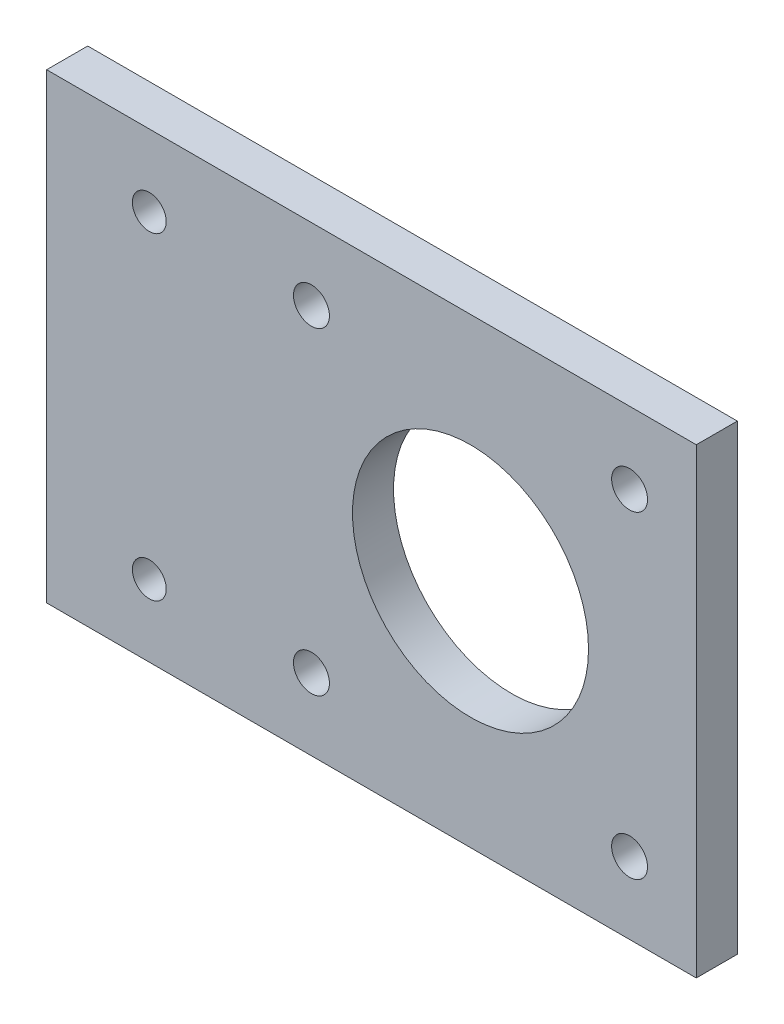
ISO-10303-21;
HEADER;
FILE_DESCRIPTION(('STEP AP214'),'2;1');
FILE_NAME('part.step','',(''),(''),'','','');
FILE_SCHEMA(('AUTOMOTIVE_DESIGN { 1 0 10303 214 1 1 1 1 }'));
ENDSEC;
DATA;
#1=APPLICATION_CONTEXT('core data for automotive mechanical design processes');
#2=APPLICATION_PROTOCOL_DEFINITION('international standard','automotive_design',2000,#1);
#3=PRODUCT_CONTEXT('',#1,'mechanical');
#4=PRODUCT('Part','Part','',(#3));
#5=PRODUCT_RELATED_PRODUCT_CATEGORY('part','',(#4));
#6=PRODUCT_DEFINITION_FORMATION('','',#4);
#7=PRODUCT_DEFINITION_CONTEXT('part definition',#1,'design');
#8=PRODUCT_DEFINITION('design','',#6,#7);
#9=PRODUCT_DEFINITION_SHAPE('','',#8);
#10=(LENGTH_UNIT() NAMED_UNIT(*) SI_UNIT(.MILLI.,.METRE.));
#11=(NAMED_UNIT(*) PLANE_ANGLE_UNIT() SI_UNIT($,.RADIAN.));
#12=(NAMED_UNIT(*) SI_UNIT($,.STERADIAN.) SOLID_ANGLE_UNIT());
#13=UNCERTAINTY_MEASURE_WITH_UNIT(LENGTH_MEASURE(1.E-05),#10,'distance_accuracy_value','');
#14=(GEOMETRIC_REPRESENTATION_CONTEXT(3) GLOBAL_UNCERTAINTY_ASSIGNED_CONTEXT((#13)) GLOBAL_UNIT_ASSIGNED_CONTEXT((#10,
#11,#12)) REPRESENTATION_CONTEXT('',''));
#15=CARTESIAN_POINT('',(0.,0.,0.));
#16=DIRECTION('',(0.,0.,1.));
#17=DIRECTION('',(1.,0.,0.));
#18=AXIS2_PLACEMENT_3D('',#15,#16,#17);
#19=CARTESIAN_POINT('',(22.,22.5,25.));
#20=DIRECTION('',(-1.,0.,0.));
#21=DIRECTION('',(0.,0.,1.));
#22=AXIS2_PLACEMENT_3D('',#19,#20,#21);
#23=PLANE('',#22);
#24=DIRECTION('',(0.,1.,0.));
#25=VECTOR('',#24,1.);
#26=CARTESIAN_POINT('',(22.,-22.5,4.));
#27=LINE('',#26,#25);
#28=CARTESIAN_POINT('',(22.,-22.5,4.));
#29=VERTEX_POINT('',#28);
#30=CARTESIAN_POINT('',(22.,22.5,4.));
#31=VERTEX_POINT('',#30);
#32=EDGE_CURVE('E71',#29,#31,#27,.T.);
#33=ORIENTED_EDGE('',*,*,#32,.F.);
#34=DIRECTION('',(0.,0.,-1.));
#35=VECTOR('',#34,1.);
#36=CARTESIAN_POINT('',(22.,-22.5,25.));
#37=LINE('',#36,#35);
#38=CARTESIAN_POINT('',(22.,-22.5,0.));
#39=VERTEX_POINT('',#38);
#40=EDGE_CURVE('E55',#29,#39,#37,.T.);
#41=ORIENTED_EDGE('',*,*,#40,.T.);
#42=DIRECTION('',(0.,1.,0.));
#43=VECTOR('',#42,1.);
#44=CARTESIAN_POINT('',(22.,22.5,0.));
#45=LINE('',#44,#43);
#46=CARTESIAN_POINT('',(22.,22.5,0.));
#47=VERTEX_POINT('',#46);
#48=EDGE_CURVE('E85',#39,#47,#45,.T.);
#49=ORIENTED_EDGE('',*,*,#48,.T.);
#50=DIRECTION('',(0.,0.,-1.));
#51=VECTOR('',#50,1.);
#52=CARTESIAN_POINT('',(22.,22.5,25.));
#53=LINE('',#52,#51);
#54=EDGE_CURVE('E11',#31,#47,#53,.T.);
#55=ORIENTED_EDGE('',*,*,#54,.F.);
#56=EDGE_LOOP('',(#33,#41,#49,#55));
#57=FACE_BOUND('',#56,.T.);
#58=ADVANCED_FACE('F32',(#57),#23,.F.);
#59=CARTESIAN_POINT('',(22.,22.5,25.));
#60=DIRECTION('',(0.,-1.,0.));
#61=DIRECTION('',(1.,0.,0.));
#62=AXIS2_PLACEMENT_3D('',#59,#60,#61);
#63=PLANE('',#62);
#64=DIRECTION('',(1.,0.,0.));
#65=VECTOR('',#64,1.);
#66=CARTESIAN_POINT('',(0.,22.5,4.));
#67=LINE('',#66,#65);
#68=CARTESIAN_POINT('',(-41.3,22.5,4.00000000000001));
#69=VERTEX_POINT('',#68);
#70=EDGE_CURVE('E74',#69,#31,#67,.T.);
#71=ORIENTED_EDGE('',*,*,#70,.T.);
#72=ORIENTED_EDGE('',*,*,#54,.T.);
#73=DIRECTION('',(-1.,0.,0.));
#74=VECTOR('',#73,1.);
#75=CARTESIAN_POINT('',(22.,22.5,0.));
#76=LINE('',#75,#74);
#77=CARTESIAN_POINT('',(-41.3,22.5,0.));
#78=VERTEX_POINT('',#77);
#79=EDGE_CURVE('E88',#47,#78,#76,.T.);
#80=ORIENTED_EDGE('',*,*,#79,.T.);
#81=DIRECTION('',(0.,0.,-1.));
#82=VECTOR('',#81,1.);
#83=CARTESIAN_POINT('',(-41.3,22.5,25.));
#84=LINE('',#83,#82);
#85=EDGE_CURVE('E40',#69,#78,#84,.T.);
#86=ORIENTED_EDGE('',*,*,#85,.F.);
#87=EDGE_LOOP('',(#71,#72,#80,#86));
#88=FACE_BOUND('',#87,.T.);
#89=ADVANCED_FACE('F80',(#88),#63,.F.);
#90=CARTESIAN_POINT('',(-41.3,22.5,25.));
#91=DIRECTION('',(1.,0.,0.));
#92=DIRECTION('',(0.,0.,-1.));
#93=AXIS2_PLACEMENT_3D('',#90,#91,#92);
#94=PLANE('',#93);
#95=DIRECTION('',(0.,1.,0.));
#96=VECTOR('',#95,1.);
#97=CARTESIAN_POINT('',(-41.3,-22.5,4.00000000000001));
#98=LINE('',#97,#96);
#99=CARTESIAN_POINT('',(-41.3,-22.5,4.));
#100=VERTEX_POINT('',#99);
#101=EDGE_CURVE('E47',#100,#69,#98,.T.);
#102=ORIENTED_EDGE('',*,*,#101,.T.);
#103=ORIENTED_EDGE('',*,*,#85,.T.);
#104=DIRECTION('',(0.,-1.,0.));
#105=VECTOR('',#104,1.);
#106=CARTESIAN_POINT('',(-41.3,22.5,0.));
#107=LINE('',#106,#105);
#108=CARTESIAN_POINT('',(-41.3,-22.5,0.));
#109=VERTEX_POINT('',#108);
#110=EDGE_CURVE('E91',#78,#109,#107,.T.);
#111=ORIENTED_EDGE('',*,*,#110,.T.);
#112=DIRECTION('',(0.,0.,-1.));
#113=VECTOR('',#112,1.);
#114=CARTESIAN_POINT('',(-41.3,-22.5,25.));
#115=LINE('',#114,#113);
#116=EDGE_CURVE('E103',#100,#109,#115,.T.);
#117=ORIENTED_EDGE('',*,*,#116,.F.);
#118=EDGE_LOOP('',(#102,#103,#111,#117));
#119=FACE_BOUND('',#118,.T.);
#120=ADVANCED_FACE('F106',(#119),#94,.F.);
#121=CARTESIAN_POINT('',(22.,-22.5,25.));
#122=DIRECTION('',(0.,1.,0.));
#123=DIRECTION('',(-1.,0.,0.));
#124=AXIS2_PLACEMENT_3D('',#121,#122,#123);
#125=PLANE('',#124);
#126=DIRECTION('',(1.,0.,0.));
#127=VECTOR('',#126,1.);
#128=CARTESIAN_POINT('',(0.,-22.5,4.));
#129=LINE('',#128,#127);
#130=EDGE_CURVE('E75',#100,#29,#129,.T.);
#131=ORIENTED_EDGE('',*,*,#130,.F.);
#132=ORIENTED_EDGE('',*,*,#116,.T.);
#133=DIRECTION('',(1.,0.,0.));
#134=VECTOR('',#133,1.);
#135=CARTESIAN_POINT('',(22.,-22.5,0.));
#136=LINE('',#135,#134);
#137=EDGE_CURVE('E100',#109,#39,#136,.T.);
#138=ORIENTED_EDGE('',*,*,#137,.T.);
#139=ORIENTED_EDGE('',*,*,#40,.F.);
#140=EDGE_LOOP('',(#131,#132,#138,#139));
#141=FACE_BOUND('',#140,.T.);
#142=ADVANCED_FACE('F112',(#141),#125,.F.);
#143=CARTESIAN_POINT('',(0.,0.,25.));
#144=DIRECTION('',(0.,0.,-1.));
#145=DIRECTION('',(-1.,0.,0.));
#146=AXIS2_PLACEMENT_3D('',#143,#144,#145);
#147=CYLINDRICAL_SURFACE('',#146,11.5);
#148=CARTESIAN_POINT('',(0.,0.,0.));
#149=DIRECTION('',(0.,0.,1.));
#150=DIRECTION('',(1.,0.,0.));
#151=AXIS2_PLACEMENT_3D('',#148,#149,#150);
#152=CIRCLE('',#151,11.5);
#153=CARTESIAN_POINT('',(11.5,0.,0.));
#154=VERTEX_POINT('',#153);
#155=EDGE_CURVE('E89',#154,#154,#152,.T.);
#156=ORIENTED_EDGE('',*,*,#155,.F.);
#157=EDGE_LOOP('',(#156));
#158=FACE_BOUND('',#157,.T.);
#159=CARTESIAN_POINT('',(0.,0.,4.));
#160=DIRECTION('',(0.,0.,1.));
#161=DIRECTION('',(1.,0.,0.));
#162=AXIS2_PLACEMENT_3D('',#159,#160,#161);
#163=CIRCLE('',#162,11.5);
#164=CARTESIAN_POINT('',(11.5,0.,3.99999999999999));
#165=VERTEX_POINT('',#164);
#166=EDGE_CURVE('E131',#165,#165,#163,.T.);
#167=ORIENTED_EDGE('',*,*,#166,.T.);
#168=EDGE_LOOP('',(#167));
#169=FACE_BOUND('',#168,.T.);
#170=ADVANCED_FACE('F156',(#158,#169),#147,.F.);
#171=CARTESIAN_POINT('',(-15.5,15.5,25.));
#172=DIRECTION('',(0.,0.,-1.));
#173=DIRECTION('',(-1.,0.,0.));
#174=AXIS2_PLACEMENT_3D('',#171,#172,#173);
#175=CYLINDRICAL_SURFACE('',#174,1.75);
#176=CARTESIAN_POINT('',(-15.5,15.5,0.));
#177=DIRECTION('',(0.,0.,1.));
#178=DIRECTION('',(1.,0.,0.));
#179=AXIS2_PLACEMENT_3D('',#176,#177,#178);
#180=CIRCLE('',#179,1.75);
#181=CARTESIAN_POINT('',(-13.75,15.5,0.));
#182=VERTEX_POINT('',#181);
#183=EDGE_CURVE('E94',#182,#182,#180,.T.);
#184=ORIENTED_EDGE('',*,*,#183,.F.);
#185=EDGE_LOOP('',(#184));
#186=FACE_BOUND('',#185,.T.);
#187=CARTESIAN_POINT('',(-15.5,15.5,4.));
#188=DIRECTION('',(0.,0.,1.));
#189=DIRECTION('',(1.,0.,0.));
#190=AXIS2_PLACEMENT_3D('',#187,#188,#189);
#191=CIRCLE('',#190,1.75);
#192=CARTESIAN_POINT('',(-13.75,15.5,4.));
#193=VERTEX_POINT('',#192);
#194=EDGE_CURVE('E128',#193,#193,#191,.T.);
#195=ORIENTED_EDGE('',*,*,#194,.T.);
#196=EDGE_LOOP('',(#195));
#197=FACE_BOUND('',#196,.T.);
#198=ADVANCED_FACE('F152',(#186,#197),#175,.F.);
#199=CARTESIAN_POINT('',(15.5,15.5,25.));
#200=DIRECTION('',(0.,0.,-1.));
#201=DIRECTION('',(-1.,0.,0.));
#202=AXIS2_PLACEMENT_3D('',#199,#200,#201);
#203=CYLINDRICAL_SURFACE('',#202,1.75);
#204=CARTESIAN_POINT('',(15.5,15.5,0.));
#205=DIRECTION('',(0.,0.,1.));
#206=DIRECTION('',(1.,0.,0.));
#207=AXIS2_PLACEMENT_3D('',#204,#205,#206);
#208=CIRCLE('',#207,1.75);
#209=CARTESIAN_POINT('',(17.25,15.5,0.));
#210=VERTEX_POINT('',#209);
#211=EDGE_CURVE('E146',#210,#210,#208,.T.);
#212=ORIENTED_EDGE('',*,*,#211,.F.);
#213=EDGE_LOOP('',(#212));
#214=FACE_BOUND('',#213,.T.);
#215=CARTESIAN_POINT('',(15.5,15.5,3.99999999999999));
#216=DIRECTION('',(0.,0.,1.));
#217=DIRECTION('',(1.,0.,0.));
#218=AXIS2_PLACEMENT_3D('',#215,#216,#217);
#219=CIRCLE('',#218,1.75);
#220=CARTESIAN_POINT('',(17.25,15.5,3.99999999999999));
#221=VERTEX_POINT('',#220);
#222=EDGE_CURVE('E125',#221,#221,#219,.T.);
#223=ORIENTED_EDGE('',*,*,#222,.T.);
#224=EDGE_LOOP('',(#223));
#225=FACE_BOUND('',#224,.T.);
#226=ADVANCED_FACE('F155',(#214,#225),#203,.F.);
#227=CARTESIAN_POINT('',(15.5,-15.5,25.));
#228=DIRECTION('',(0.,0.,-1.));
#229=DIRECTION('',(-1.,0.,0.));
#230=AXIS2_PLACEMENT_3D('',#227,#228,#229);
#231=CYLINDRICAL_SURFACE('',#230,1.75);
#232=CARTESIAN_POINT('',(15.5,-15.5,0.));
#233=DIRECTION('',(0.,0.,1.));
#234=DIRECTION('',(1.,0.,0.));
#235=AXIS2_PLACEMENT_3D('',#232,#233,#234);
#236=CIRCLE('',#235,1.75);
#237=CARTESIAN_POINT('',(17.25,-15.5,0.));
#238=VERTEX_POINT('',#237);
#239=EDGE_CURVE('E143',#238,#238,#236,.T.);
#240=ORIENTED_EDGE('',*,*,#239,.F.);
#241=EDGE_LOOP('',(#240));
#242=FACE_BOUND('',#241,.T.);
#243=CARTESIAN_POINT('',(15.5,-15.5,3.99999999999999));
#244=DIRECTION('',(0.,0.,1.));
#245=DIRECTION('',(1.,0.,0.));
#246=AXIS2_PLACEMENT_3D('',#243,#244,#245);
#247=CIRCLE('',#246,1.75);
#248=CARTESIAN_POINT('',(17.25,-15.5,3.99999999999999));
#249=VERTEX_POINT('',#248);
#250=EDGE_CURVE('E122',#249,#249,#247,.T.);
#251=ORIENTED_EDGE('',*,*,#250,.T.);
#252=EDGE_LOOP('',(#251));
#253=FACE_BOUND('',#252,.T.);
#254=ADVANCED_FACE('F206',(#242,#253),#231,.F.);
#255=CARTESIAN_POINT('',(-15.5,-15.5,25.));
#256=DIRECTION('',(0.,0.,-1.));
#257=DIRECTION('',(-1.,0.,0.));
#258=AXIS2_PLACEMENT_3D('',#255,#256,#257);
#259=CYLINDRICAL_SURFACE('',#258,1.75);
#260=CARTESIAN_POINT('',(-15.5,-15.5,0.));
#261=DIRECTION('',(0.,0.,1.));
#262=DIRECTION('',(1.,0.,0.));
#263=AXIS2_PLACEMENT_3D('',#260,#261,#262);
#264=CIRCLE('',#263,1.75);
#265=CARTESIAN_POINT('',(-13.75,-15.5,0.));
#266=VERTEX_POINT('',#265);
#267=EDGE_CURVE('E140',#266,#266,#264,.T.);
#268=ORIENTED_EDGE('',*,*,#267,.F.);
#269=EDGE_LOOP('',(#268));
#270=FACE_BOUND('',#269,.T.);
#271=CARTESIAN_POINT('',(-15.5,-15.5,4.));
#272=DIRECTION('',(0.,0.,1.));
#273=DIRECTION('',(1.,0.,0.));
#274=AXIS2_PLACEMENT_3D('',#271,#272,#273);
#275=CIRCLE('',#274,1.75);
#276=CARTESIAN_POINT('',(-13.75,-15.5,4.));
#277=VERTEX_POINT('',#276);
#278=EDGE_CURVE('E119',#277,#277,#275,.T.);
#279=ORIENTED_EDGE('',*,*,#278,.T.);
#280=EDGE_LOOP('',(#279));
#281=FACE_BOUND('',#280,.T.);
#282=ADVANCED_FACE('F186',(#270,#281),#259,.F.);
#283=CARTESIAN_POINT('',(-31.3,-15.5,25.));
#284=DIRECTION('',(0.,0.,-1.));
#285=DIRECTION('',(-1.,0.,0.));
#286=AXIS2_PLACEMENT_3D('',#283,#284,#285);
#287=CYLINDRICAL_SURFACE('',#286,1.65);
#288=CARTESIAN_POINT('',(-31.3,-15.5,0.));
#289=DIRECTION('',(0.,0.,1.));
#290=DIRECTION('',(1.,0.,0.));
#291=AXIS2_PLACEMENT_3D('',#288,#289,#290);
#292=CIRCLE('',#291,1.65);
#293=CARTESIAN_POINT('',(-29.65,-15.5,0.));
#294=VERTEX_POINT('',#293);
#295=EDGE_CURVE('E137',#294,#294,#292,.T.);
#296=ORIENTED_EDGE('',*,*,#295,.F.);
#297=EDGE_LOOP('',(#296));
#298=FACE_BOUND('',#297,.T.);
#299=CARTESIAN_POINT('',(-31.3,-15.5,4.00000000000001));
#300=DIRECTION('',(0.,0.,1.));
#301=DIRECTION('',(1.,0.,0.));
#302=AXIS2_PLACEMENT_3D('',#299,#300,#301);
#303=CIRCLE('',#302,1.65);
#304=CARTESIAN_POINT('',(-29.65,-15.5,4.00000000000001));
#305=VERTEX_POINT('',#304);
#306=EDGE_CURVE('E116',#305,#305,#303,.T.);
#307=ORIENTED_EDGE('',*,*,#306,.T.);
#308=EDGE_LOOP('',(#307));
#309=FACE_BOUND('',#308,.T.);
#310=ADVANCED_FACE('F177',(#298,#309),#287,.F.);
#311=CARTESIAN_POINT('',(-31.3,15.5,25.));
#312=DIRECTION('',(0.,0.,-1.));
#313=DIRECTION('',(-1.,0.,0.));
#314=AXIS2_PLACEMENT_3D('',#311,#312,#313);
#315=CYLINDRICAL_SURFACE('',#314,1.65);
#316=CARTESIAN_POINT('',(-31.3,15.5,0.));
#317=DIRECTION('',(0.,0.,1.));
#318=DIRECTION('',(1.,0.,0.));
#319=AXIS2_PLACEMENT_3D('',#316,#317,#318);
#320=CIRCLE('',#319,1.65);
#321=CARTESIAN_POINT('',(-29.65,15.5,0.));
#322=VERTEX_POINT('',#321);
#323=EDGE_CURVE('E134',#322,#322,#320,.T.);
#324=ORIENTED_EDGE('',*,*,#323,.F.);
#325=EDGE_LOOP('',(#324));
#326=FACE_BOUND('',#325,.T.);
#327=CARTESIAN_POINT('',(-31.3,15.5,4.00000000000001));
#328=DIRECTION('',(0.,0.,1.));
#329=DIRECTION('',(1.,0.,0.));
#330=AXIS2_PLACEMENT_3D('',#327,#328,#329);
#331=CIRCLE('',#330,1.65);
#332=CARTESIAN_POINT('',(-29.65,15.5,4.00000000000001));
#333=VERTEX_POINT('',#332);
#334=EDGE_CURVE('E35',#333,#333,#331,.T.);
#335=ORIENTED_EDGE('',*,*,#334,.T.);
#336=EDGE_LOOP('',(#335));
#337=FACE_BOUND('',#336,.T.);
#338=ADVANCED_FACE('F175',(#326,#337),#315,.F.);
#339=CARTESIAN_POINT('',(0.,0.,0.));
#340=DIRECTION('',(0.,0.,-1.));
#341=DIRECTION('',(-1.,0.,0.));
#342=AXIS2_PLACEMENT_3D('',#339,#340,#341);
#343=PLANE('',#342);
#344=ORIENTED_EDGE('',*,*,#295,.T.);
#345=EDGE_LOOP('',(#344));
#346=FACE_BOUND('',#345,.T.);
#347=ORIENTED_EDGE('',*,*,#239,.T.);
#348=EDGE_LOOP('',(#347));
#349=FACE_BOUND('',#348,.T.);
#350=ORIENTED_EDGE('',*,*,#183,.T.);
#351=EDGE_LOOP('',(#350));
#352=FACE_BOUND('',#351,.T.);
#353=ORIENTED_EDGE('',*,*,#48,.F.);
#354=ORIENTED_EDGE('',*,*,#137,.F.);
#355=ORIENTED_EDGE('',*,*,#110,.F.);
#356=ORIENTED_EDGE('',*,*,#79,.F.);
#357=EDGE_LOOP('',(#353,#354,#355,#356));
#358=FACE_BOUND('',#357,.T.);
#359=ORIENTED_EDGE('',*,*,#155,.T.);
#360=EDGE_LOOP('',(#359));
#361=FACE_BOUND('',#360,.T.);
#362=ORIENTED_EDGE('',*,*,#211,.T.);
#363=EDGE_LOOP('',(#362));
#364=FACE_BOUND('',#363,.T.);
#365=ORIENTED_EDGE('',*,*,#267,.T.);
#366=EDGE_LOOP('',(#365));
#367=FACE_BOUND('',#366,.T.);
#368=ORIENTED_EDGE('',*,*,#323,.T.);
#369=EDGE_LOOP('',(#368));
#370=FACE_BOUND('',#369,.T.);
#371=ADVANCED_FACE('F109',(#346,#349,#352,#358,#361,#364,#367,#370),#343,.T.);
#372=CARTESIAN_POINT('',(0.,-22.5,4.));
#373=DIRECTION('',(0.,0.,1.));
#374=DIRECTION('',(1.,0.,0.));
#375=AXIS2_PLACEMENT_3D('',#372,#373,#374);
#376=PLANE('',#375);
#377=ORIENTED_EDGE('',*,*,#166,.F.);
#378=EDGE_LOOP('',(#377));
#379=FACE_BOUND('',#378,.T.);
#380=ORIENTED_EDGE('',*,*,#194,.F.);
#381=EDGE_LOOP('',(#380));
#382=FACE_BOUND('',#381,.T.);
#383=ORIENTED_EDGE('',*,*,#222,.F.);
#384=EDGE_LOOP('',(#383));
#385=FACE_BOUND('',#384,.T.);
#386=ORIENTED_EDGE('',*,*,#250,.F.);
#387=EDGE_LOOP('',(#386));
#388=FACE_BOUND('',#387,.T.);
#389=ORIENTED_EDGE('',*,*,#278,.F.);
#390=EDGE_LOOP('',(#389));
#391=FACE_BOUND('',#390,.T.);
#392=ORIENTED_EDGE('',*,*,#306,.F.);
#393=EDGE_LOOP('',(#392));
#394=FACE_BOUND('',#393,.T.);
#395=ORIENTED_EDGE('',*,*,#334,.F.);
#396=EDGE_LOOP('',(#395));
#397=FACE_BOUND('',#396,.T.);
#398=ORIENTED_EDGE('',*,*,#101,.F.);
#399=ORIENTED_EDGE('',*,*,#130,.T.);
#400=ORIENTED_EDGE('',*,*,#32,.T.);
#401=ORIENTED_EDGE('',*,*,#70,.F.);
#402=EDGE_LOOP('',(#398,#399,#400,#401));
#403=FACE_BOUND('',#402,.T.);
#404=ADVANCED_FACE('F73',(#379,#382,#385,#388,#391,#394,#397,#403),#376,.T.);
#405=CLOSED_SHELL('',(#58,#89,#120,#142,#170,#198,#226,#254,#282,#310,#338,#371,#404));
#406=MANIFOLD_SOLID_BREP('B2',#405);
#407=ADVANCED_BREP_SHAPE_REPRESENTATION('',(#18,#406),#14);
#408=SHAPE_DEFINITION_REPRESENTATION(#9,#407);
ENDSEC;
END-ISO-10303-21;
